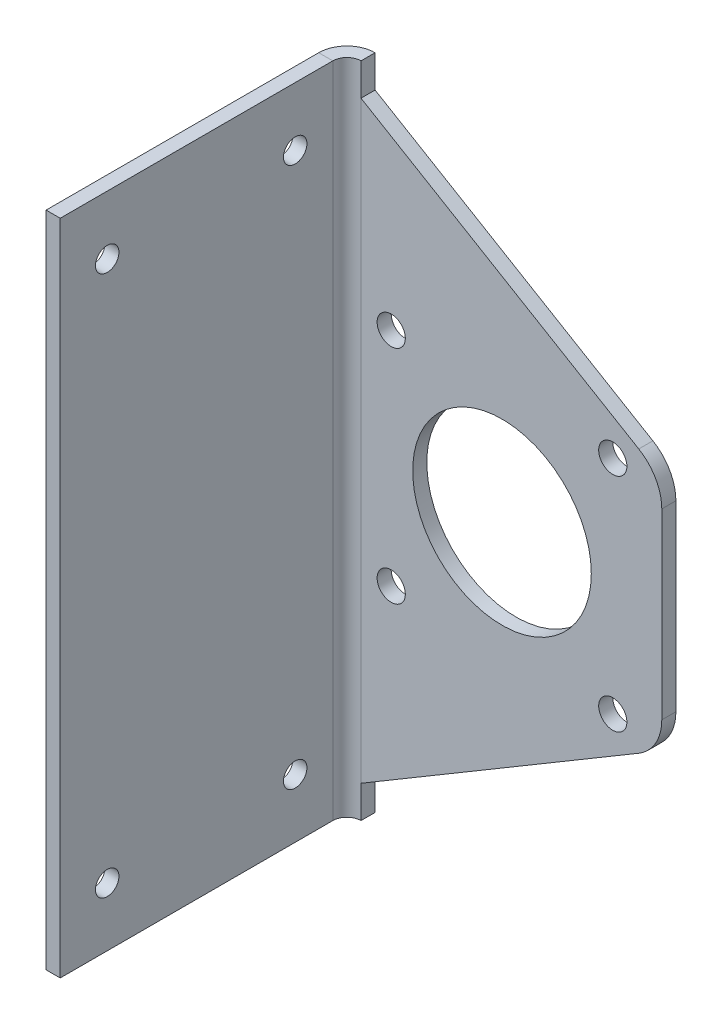
ISO-10303-21;
HEADER;
FILE_DESCRIPTION(('STEP AP214'),'2;1');
FILE_NAME('part.step','',(''),(''),'','','');
FILE_SCHEMA(('AUTOMOTIVE_DESIGN { 1 0 10303 214 1 1 1 1 }'));
ENDSEC;
DATA;
#1=APPLICATION_CONTEXT('core data for automotive mechanical design processes');
#2=APPLICATION_PROTOCOL_DEFINITION('international standard','automotive_design',2000,#1);
#3=PRODUCT_CONTEXT('',#1,'mechanical');
#4=PRODUCT('Part','Part','',(#3));
#5=PRODUCT_RELATED_PRODUCT_CATEGORY('part','',(#4));
#6=PRODUCT_DEFINITION_FORMATION('','',#4);
#7=PRODUCT_DEFINITION_CONTEXT('part definition',#1,'design');
#8=PRODUCT_DEFINITION('design','',#6,#7);
#9=PRODUCT_DEFINITION_SHAPE('','',#8);
#10=(LENGTH_UNIT() NAMED_UNIT(*) SI_UNIT(.MILLI.,.METRE.));
#11=(NAMED_UNIT(*) PLANE_ANGLE_UNIT() SI_UNIT($,.RADIAN.));
#12=(NAMED_UNIT(*) SI_UNIT($,.STERADIAN.) SOLID_ANGLE_UNIT());
#13=UNCERTAINTY_MEASURE_WITH_UNIT(LENGTH_MEASURE(1.E-05),#10,'distance_accuracy_value','');
#14=(GEOMETRIC_REPRESENTATION_CONTEXT(3) GLOBAL_UNCERTAINTY_ASSIGNED_CONTEXT((#13)) GLOBAL_UNIT_ASSIGNED_CONTEXT((#10,
#11,#12)) REPRESENTATION_CONTEXT('',''));
#15=CARTESIAN_POINT('',(0.,0.,0.));
#16=DIRECTION('',(0.,0.,1.));
#17=DIRECTION('',(1.,0.,0.));
#18=AXIS2_PLACEMENT_3D('',#15,#16,#17);
#19=CARTESIAN_POINT('',(-35.,140.,3.));
#20=DIRECTION('',(0.,0.,-1.));
#21=DIRECTION('',(-1.,0.,0.));
#22=AXIS2_PLACEMENT_3D('',#19,#20,#21);
#23=PLANE('',#22);
#24=CARTESIAN_POINT('',(-22.57,46.43,3.));
#25=DIRECTION('',(0.,0.,1.));
#26=DIRECTION('',(1.,0.,0.));
#27=AXIS2_PLACEMENT_3D('',#24,#25,#26);
#28=CIRCLE('',#27,3.);
#29=CARTESIAN_POINT('',(-19.57,46.43,3.));
#30=VERTEX_POINT('',#29);
#31=EDGE_CURVE('E258',#30,#30,#28,.T.);
#32=ORIENTED_EDGE('',*,*,#31,.F.);
#33=EDGE_LOOP('',(#32));
#34=FACE_BOUND('',#33,.T.);
#35=CARTESIAN_POINT('',(24.57,46.43,3.));
#36=DIRECTION('',(0.,0.,1.));
#37=DIRECTION('',(1.,0.,0.));
#38=AXIS2_PLACEMENT_3D('',#35,#36,#37);
#39=CIRCLE('',#38,3.);
#40=CARTESIAN_POINT('',(27.57,46.43,3.));
#41=VERTEX_POINT('',#40);
#42=EDGE_CURVE('E277',#41,#41,#39,.T.);
#43=ORIENTED_EDGE('',*,*,#42,.F.);
#44=EDGE_LOOP('',(#43));
#45=FACE_BOUND('',#44,.T.);
#46=CARTESIAN_POINT('',(-22.57,93.57,3.));
#47=DIRECTION('',(0.,0.,1.));
#48=DIRECTION('',(1.,0.,0.));
#49=AXIS2_PLACEMENT_3D('',#46,#47,#48);
#50=CIRCLE('',#49,3.);
#51=CARTESIAN_POINT('',(-19.57,93.57,3.));
#52=VERTEX_POINT('',#51);
#53=EDGE_CURVE('E271',#52,#52,#50,.T.);
#54=ORIENTED_EDGE('',*,*,#53,.F.);
#55=EDGE_LOOP('',(#54));
#56=FACE_BOUND('',#55,.T.);
#57=CARTESIAN_POINT('',(24.57,93.57,3.));
#58=DIRECTION('',(0.,0.,1.));
#59=DIRECTION('',(1.,0.,0.));
#60=AXIS2_PLACEMENT_3D('',#57,#58,#59);
#61=CIRCLE('',#60,3.);
#62=CARTESIAN_POINT('',(27.57,93.57,3.));
#63=VERTEX_POINT('',#62);
#64=EDGE_CURVE('E265',#63,#63,#61,.T.);
#65=ORIENTED_EDGE('',*,*,#64,.F.);
#66=EDGE_LOOP('',(#65));
#67=FACE_BOUND('',#66,.T.);
#68=CARTESIAN_POINT('',(0.999999999999984,70.,3.));
#69=DIRECTION('',(0.,0.,1.));
#70=DIRECTION('',(1.,0.,0.));
#71=AXIS2_PLACEMENT_3D('',#68,#69,#70);
#72=CIRCLE('',#71,19.);
#73=CARTESIAN_POINT('',(20.,70.,3.));
#74=VERTEX_POINT('',#73);
#75=EDGE_CURVE('E264',#74,#74,#72,.T.);
#76=ORIENTED_EDGE('',*,*,#75,.F.);
#77=EDGE_LOOP('',(#76));
#78=FACE_BOUND('',#77,.T.);
#79=DIRECTION('',(0.,-1.,0.));
#80=VECTOR('',#79,1.);
#81=CARTESIAN_POINT('',(35.,140.,3.));
#82=LINE('',#81,#80);
#83=CARTESIAN_POINT('',(35.,89.4369115321401,3.));
#84=VERTEX_POINT('',#83);
#85=CARTESIAN_POINT('',(35.,50.5630884678599,3.));
#86=VERTEX_POINT('',#85);
#87=EDGE_CURVE('E181',#84,#86,#82,.T.);
#88=ORIENTED_EDGE('',*,*,#87,.F.);
#89=CARTESIAN_POINT('',(25.,89.4369115321401,3.));
#90=DIRECTION('',(0.,0.,-1.));
#91=DIRECTION('',(-1.,0.,0.));
#92=AXIS2_PLACEMENT_3D('',#89,#90,#91);
#93=CIRCLE('',#92,10.);
#94=CARTESIAN_POINT('',(30.1042062990609,98.0361602235449,3.));
#95=VERTEX_POINT('',#94);
#96=EDGE_CURVE('E78',#84,#95,#93,.F.);
#97=ORIENTED_EDGE('',*,*,#96,.T.);
#98=DIRECTION('',(-0.85992486914048,0.510420629906088,0.));
#99=VECTOR('',#98,1.);
#100=CARTESIAN_POINT('',(-29.,133.118302038352,3.));
#101=LINE('',#100,#99);
#102=CARTESIAN_POINT('',(-29.,133.118302038352,3.));
#103=VERTEX_POINT('',#102);
#104=EDGE_CURVE('E229',#95,#103,#101,.T.);
#105=ORIENTED_EDGE('',*,*,#104,.T.);
#106=DIRECTION('',(0.,-1.,0.));
#107=VECTOR('',#106,1.);
#108=CARTESIAN_POINT('',(-29.,0.,3.));
#109=LINE('',#108,#107);
#110=CARTESIAN_POINT('',(-29.,6.88169796164767,3.));
#111=VERTEX_POINT('',#110);
#112=EDGE_CURVE('E154',#111,#103,#109,.F.);
#113=ORIENTED_EDGE('',*,*,#112,.F.);
#114=DIRECTION('',(0.85992486914048,0.510420629906088,0.));
#115=VECTOR('',#114,1.);
#116=CARTESIAN_POINT('',(-29.,6.88169796164767,3.));
#117=LINE('',#116,#115);
#118=CARTESIAN_POINT('',(30.1042062990609,41.9638397764551,3.));
#119=VERTEX_POINT('',#118);
#120=EDGE_CURVE('E206',#111,#119,#117,.T.);
#121=ORIENTED_EDGE('',*,*,#120,.T.);
#122=CARTESIAN_POINT('',(25.,50.5630884678599,3.));
#123=DIRECTION('',(0.,0.,-1.));
#124=DIRECTION('',(-1.,0.,0.));
#125=AXIS2_PLACEMENT_3D('',#122,#123,#124);
#126=CIRCLE('',#125,10.);
#127=EDGE_CURVE('E186',#119,#86,#126,.F.);
#128=ORIENTED_EDGE('',*,*,#127,.T.);
#129=EDGE_LOOP('',(#88,#97,#105,#113,#121,#128));
#130=FACE_BOUND('',#129,.T.);
#131=ADVANCED_FACE('F56',(#34,#45,#56,#67,#78,#130),#23,.F.);
#132=CARTESIAN_POINT('',(-35.,140.,0.));
#133=DIRECTION('',(0.,0.,-1.));
#134=DIRECTION('',(-1.,0.,0.));
#135=AXIS2_PLACEMENT_3D('',#132,#133,#134);
#136=PLANE('',#135);
#137=CARTESIAN_POINT('',(-22.57,46.43,0.));
#138=DIRECTION('',(0.,0.,1.));
#139=DIRECTION('',(1.,0.,0.));
#140=AXIS2_PLACEMENT_3D('',#137,#138,#139);
#141=CIRCLE('',#140,3.);
#142=CARTESIAN_POINT('',(-19.57,46.43,0.));
#143=VERTEX_POINT('',#142);
#144=EDGE_CURVE('E280',#143,#143,#141,.T.);
#145=ORIENTED_EDGE('',*,*,#144,.T.);
#146=EDGE_LOOP('',(#145));
#147=FACE_BOUND('',#146,.T.);
#148=CARTESIAN_POINT('',(24.57,46.43,0.));
#149=DIRECTION('',(0.,0.,1.));
#150=DIRECTION('',(1.,0.,0.));
#151=AXIS2_PLACEMENT_3D('',#148,#149,#150);
#152=CIRCLE('',#151,3.);
#153=CARTESIAN_POINT('',(27.57,46.43,0.));
#154=VERTEX_POINT('',#153);
#155=EDGE_CURVE('E274',#154,#154,#152,.T.);
#156=ORIENTED_EDGE('',*,*,#155,.T.);
#157=EDGE_LOOP('',(#156));
#158=FACE_BOUND('',#157,.T.);
#159=CARTESIAN_POINT('',(-22.57,93.57,0.));
#160=DIRECTION('',(0.,0.,1.));
#161=DIRECTION('',(1.,0.,0.));
#162=AXIS2_PLACEMENT_3D('',#159,#160,#161);
#163=CIRCLE('',#162,3.);
#164=CARTESIAN_POINT('',(-19.57,93.57,0.));
#165=VERTEX_POINT('',#164);
#166=EDGE_CURVE('E268',#165,#165,#163,.T.);
#167=ORIENTED_EDGE('',*,*,#166,.T.);
#168=EDGE_LOOP('',(#167));
#169=FACE_BOUND('',#168,.T.);
#170=CARTESIAN_POINT('',(24.57,93.57,0.));
#171=DIRECTION('',(0.,0.,1.));
#172=DIRECTION('',(1.,0.,0.));
#173=AXIS2_PLACEMENT_3D('',#170,#171,#172);
#174=CIRCLE('',#173,3.);
#175=CARTESIAN_POINT('',(27.57,93.57,0.));
#176=VERTEX_POINT('',#175);
#177=EDGE_CURVE('E261',#176,#176,#174,.T.);
#178=ORIENTED_EDGE('',*,*,#177,.T.);
#179=EDGE_LOOP('',(#178));
#180=FACE_BOUND('',#179,.T.);
#181=CARTESIAN_POINT('',(0.999999999999984,70.,0.));
#182=DIRECTION('',(0.,0.,1.));
#183=DIRECTION('',(1.,0.,0.));
#184=AXIS2_PLACEMENT_3D('',#181,#182,#183);
#185=CIRCLE('',#184,19.);
#186=CARTESIAN_POINT('',(20.,70.,0.));
#187=VERTEX_POINT('',#186);
#188=EDGE_CURVE('E285',#187,#187,#185,.T.);
#189=ORIENTED_EDGE('',*,*,#188,.T.);
#190=EDGE_LOOP('',(#189));
#191=FACE_BOUND('',#190,.T.);
#192=DIRECTION('',(-0.85992486914048,0.510420629906088,0.));
#193=VECTOR('',#192,1.);
#194=CARTESIAN_POINT('',(-29.,133.118302038352,0.));
#195=LINE('',#194,#193);
#196=CARTESIAN_POINT('',(30.1042062990609,98.0361602235449,0.));
#197=VERTEX_POINT('',#196);
#198=CARTESIAN_POINT('',(-29.,133.118302038352,0.));
#199=VERTEX_POINT('',#198);
#200=EDGE_CURVE('E234',#197,#199,#195,.T.);
#201=ORIENTED_EDGE('',*,*,#200,.F.);
#202=CARTESIAN_POINT('',(25.,89.4369115321401,0.));
#203=DIRECTION('',(0.,0.,-1.));
#204=DIRECTION('',(-1.,0.,0.));
#205=AXIS2_PLACEMENT_3D('',#202,#203,#204);
#206=CIRCLE('',#205,10.);
#207=CARTESIAN_POINT('',(35.,89.4369115321401,0.));
#208=VERTEX_POINT('',#207);
#209=EDGE_CURVE('E13',#197,#208,#206,.T.);
#210=ORIENTED_EDGE('',*,*,#209,.T.);
#211=DIRECTION('',(0.,-1.,0.));
#212=VECTOR('',#211,1.);
#213=CARTESIAN_POINT('',(35.,140.,0.));
#214=LINE('',#213,#212);
#215=CARTESIAN_POINT('',(35.,50.5630884678599,0.));
#216=VERTEX_POINT('',#215);
#217=EDGE_CURVE('E178',#208,#216,#214,.T.);
#218=ORIENTED_EDGE('',*,*,#217,.T.);
#219=CARTESIAN_POINT('',(25.,50.5630884678599,0.));
#220=DIRECTION('',(0.,0.,-1.));
#221=DIRECTION('',(-1.,0.,0.));
#222=AXIS2_PLACEMENT_3D('',#219,#220,#221);
#223=CIRCLE('',#222,10.);
#224=CARTESIAN_POINT('',(30.1042062990609,41.9638397764551,0.));
#225=VERTEX_POINT('',#224);
#226=EDGE_CURVE('E192',#216,#225,#223,.T.);
#227=ORIENTED_EDGE('',*,*,#226,.T.);
#228=DIRECTION('',(0.85992486914048,0.510420629906088,0.));
#229=VECTOR('',#228,1.);
#230=CARTESIAN_POINT('',(-29.,6.88169796164767,0.));
#231=LINE('',#230,#229);
#232=CARTESIAN_POINT('',(-29.,6.88169796164767,0.));
#233=VERTEX_POINT('',#232);
#234=EDGE_CURVE('E216',#233,#225,#231,.T.);
#235=ORIENTED_EDGE('',*,*,#234,.F.);
#236=DIRECTION('',(0.,-1.,0.));
#237=VECTOR('',#236,1.);
#238=CARTESIAN_POINT('',(-29.,0.,0.));
#239=LINE('',#238,#237);
#240=EDGE_CURVE('E318',#233,#199,#239,.F.);
#241=ORIENTED_EDGE('',*,*,#240,.T.);
#242=EDGE_LOOP('',(#201,#210,#218,#227,#235,#241));
#243=FACE_BOUND('',#242,.T.);
#244=ADVANCED_FACE('F214',(#147,#158,#169,#180,#191,#243),#136,.T.);
#245=CARTESIAN_POINT('',(35.,140.,0.));
#246=DIRECTION('',(1.,0.,0.));
#247=DIRECTION('',(0.,0.,-1.));
#248=AXIS2_PLACEMENT_3D('',#245,#246,#247);
#249=PLANE('',#248);
#250=ORIENTED_EDGE('',*,*,#217,.F.);
#251=DIRECTION('',(0.,0.,-1.));
#252=VECTOR('',#251,1.);
#253=CARTESIAN_POINT('',(35.,89.4369115321401,0.));
#254=LINE('',#253,#252);
#255=EDGE_CURVE('E194',#208,#84,#254,.F.);
#256=ORIENTED_EDGE('',*,*,#255,.T.);
#257=ORIENTED_EDGE('',*,*,#87,.T.);
#258=DIRECTION('',(0.,0.,-1.));
#259=VECTOR('',#258,1.);
#260=CARTESIAN_POINT('',(35.,50.5630884678599,0.));
#261=LINE('',#260,#259);
#262=EDGE_CURVE('E189',#86,#216,#261,.T.);
#263=ORIENTED_EDGE('',*,*,#262,.T.);
#264=EDGE_LOOP('',(#250,#256,#257,#263));
#265=FACE_BOUND('',#264,.T.);
#266=ADVANCED_FACE('F200',(#265),#249,.T.);
#267=CARTESIAN_POINT('',(-29.,140.,6.));
#268=DIRECTION('',(0.,1.,0.));
#269=DIRECTION('',(0.,0.,1.));
#270=AXIS2_PLACEMENT_3D('',#267,#268,#269);
#271=PLANE('',#270);
#272=DIRECTION('',(-1.,0.,0.));
#273=VECTOR('',#272,1.);
#274=CARTESIAN_POINT('',(-35.,140.,5.99999999999998));
#275=LINE('',#274,#273);
#276=CARTESIAN_POINT('',(-32.,140.,5.99999999999999));
#277=VERTEX_POINT('',#276);
#278=CARTESIAN_POINT('',(-35.,140.,5.99999999999998));
#279=VERTEX_POINT('',#278);
#280=EDGE_CURVE('E288',#277,#279,#275,.T.);
#281=ORIENTED_EDGE('',*,*,#280,.F.);
#282=CARTESIAN_POINT('',(-29.,140.,6.));
#283=DIRECTION('',(0.,-1.,0.));
#284=DIRECTION('',(0.,0.,-1.));
#285=AXIS2_PLACEMENT_3D('',#282,#283,#284);
#286=CIRCLE('',#285,3.);
#287=CARTESIAN_POINT('',(-29.,140.,3.));
#288=VERTEX_POINT('',#287);
#289=EDGE_CURVE('E153',#288,#277,#286,.F.);
#290=ORIENTED_EDGE('',*,*,#289,.F.);
#291=DIRECTION('',(0.,0.,-1.));
#292=VECTOR('',#291,1.);
#293=CARTESIAN_POINT('',(-29.,140.,3.));
#294=LINE('',#293,#292);
#295=CARTESIAN_POINT('',(-29.,140.,0.));
#296=VERTEX_POINT('',#295);
#297=EDGE_CURVE('E164',#288,#296,#294,.T.);
#298=ORIENTED_EDGE('',*,*,#297,.T.);
#299=CARTESIAN_POINT('',(-29.,140.,6.));
#300=DIRECTION('',(0.,-1.,0.));
#301=DIRECTION('',(0.,0.,-1.));
#302=AXIS2_PLACEMENT_3D('',#299,#300,#301);
#303=CIRCLE('',#302,6.);
#304=EDGE_CURVE('E165',#296,#279,#303,.F.);
#305=ORIENTED_EDGE('',*,*,#304,.T.);
#306=EDGE_LOOP('',(#281,#290,#298,#305));
#307=FACE_BOUND('',#306,.T.);
#308=ADVANCED_FACE('F346',(#307),#271,.T.);
#309=CARTESIAN_POINT('',(-29.,0.,6.));
#310=DIRECTION('',(0.,1.,0.));
#311=DIRECTION('',(0.,0.,1.));
#312=AXIS2_PLACEMENT_3D('',#309,#310,#311);
#313=PLANE('',#312);
#314=CARTESIAN_POINT('',(-29.,0.,6.));
#315=DIRECTION('',(0.,-1.,0.));
#316=DIRECTION('',(0.,0.,-1.));
#317=AXIS2_PLACEMENT_3D('',#314,#315,#316);
#318=CIRCLE('',#317,3.);
#319=CARTESIAN_POINT('',(-32.,0.,5.99999999999999));
#320=VERTEX_POINT('',#319);
#321=CARTESIAN_POINT('',(-29.,0.,3.));
#322=VERTEX_POINT('',#321);
#323=EDGE_CURVE('E161',#320,#322,#318,.T.);
#324=ORIENTED_EDGE('',*,*,#323,.F.);
#325=DIRECTION('',(-1.,0.,0.));
#326=VECTOR('',#325,1.);
#327=CARTESIAN_POINT('',(-32.,0.,5.99999999999999));
#328=LINE('',#327,#326);
#329=CARTESIAN_POINT('',(-35.,0.,5.99999999999998));
#330=VERTEX_POINT('',#329);
#331=EDGE_CURVE('E311',#320,#330,#328,.T.);
#332=ORIENTED_EDGE('',*,*,#331,.T.);
#333=CARTESIAN_POINT('',(-29.,0.,6.));
#334=DIRECTION('',(0.,-1.,0.));
#335=DIRECTION('',(0.,0.,-1.));
#336=AXIS2_PLACEMENT_3D('',#333,#334,#335);
#337=CIRCLE('',#336,6.);
#338=CARTESIAN_POINT('',(-29.,0.,0.));
#339=VERTEX_POINT('',#338);
#340=EDGE_CURVE('E163',#330,#339,#337,.T.);
#341=ORIENTED_EDGE('',*,*,#340,.T.);
#342=DIRECTION('',(0.,0.,-1.));
#343=VECTOR('',#342,1.);
#344=CARTESIAN_POINT('',(-29.,0.,3.));
#345=LINE('',#344,#343);
#346=EDGE_CURVE('E145',#322,#339,#345,.T.);
#347=ORIENTED_EDGE('',*,*,#346,.F.);
#348=EDGE_LOOP('',(#324,#332,#341,#347));
#349=FACE_BOUND('',#348,.T.);
#350=ADVANCED_FACE('F159',(#349),#313,.F.);
#351=CARTESIAN_POINT('',(-29.,0.,6.));
#352=DIRECTION('',(0.,-1.,0.));
#353=DIRECTION('',(-1.,0.,0.));
#354=AXIS2_PLACEMENT_3D('',#351,#352,#353);
#355=CYLINDRICAL_SURFACE('',#354,6.);
#356=EDGE_CURVE('E316',#339,#233,#239,.F.);
#357=ORIENTED_EDGE('',*,*,#356,.F.);
#358=ORIENTED_EDGE('',*,*,#340,.F.);
#359=DIRECTION('',(0.,-1.,0.));
#360=VECTOR('',#359,1.);
#361=CARTESIAN_POINT('',(-35.,0.,5.99999999999998));
#362=LINE('',#361,#360);
#363=EDGE_CURVE('E308',#279,#330,#362,.T.);
#364=ORIENTED_EDGE('',*,*,#363,.F.);
#365=ORIENTED_EDGE('',*,*,#304,.F.);
#366=DIRECTION('',(0.,1.,0.));
#367=VECTOR('',#366,1.);
#368=CARTESIAN_POINT('',(-29.,117.565096139335,0.));
#369=LINE('',#368,#367);
#370=EDGE_CURVE('E231',#199,#296,#369,.T.);
#371=ORIENTED_EDGE('',*,*,#370,.F.);
#372=ORIENTED_EDGE('',*,*,#240,.F.);
#373=EDGE_LOOP('',(#357,#358,#364,#365,#371,#372));
#374=FACE_BOUND('',#373,.T.);
#375=ADVANCED_FACE('F344',(#374),#355,.T.);
#376=CARTESIAN_POINT('',(-29.,0.,6.));
#377=DIRECTION('',(0.,-1.,0.));
#378=DIRECTION('',(-1.,0.,0.));
#379=AXIS2_PLACEMENT_3D('',#376,#377,#378);
#380=CYLINDRICAL_SURFACE('',#379,3.);
#381=EDGE_CURVE('E142',#322,#111,#109,.F.);
#382=ORIENTED_EDGE('',*,*,#381,.T.);
#383=ORIENTED_EDGE('',*,*,#112,.T.);
#384=DIRECTION('',(0.,1.,0.));
#385=VECTOR('',#384,1.);
#386=CARTESIAN_POINT('',(-29.,140.,3.));
#387=LINE('',#386,#385);
#388=EDGE_CURVE('E224',#103,#288,#387,.T.);
#389=ORIENTED_EDGE('',*,*,#388,.T.);
#390=ORIENTED_EDGE('',*,*,#289,.T.);
#391=DIRECTION('',(0.,1.,0.));
#392=VECTOR('',#391,1.);
#393=CARTESIAN_POINT('',(-32.,140.,5.99999999999999));
#394=LINE('',#393,#392);
#395=EDGE_CURVE('E170',#277,#320,#394,.F.);
#396=ORIENTED_EDGE('',*,*,#395,.T.);
#397=ORIENTED_EDGE('',*,*,#323,.T.);
#398=EDGE_LOOP('',(#382,#383,#389,#390,#396,#397));
#399=FACE_BOUND('',#398,.T.);
#400=ADVANCED_FACE('F167',(#399),#380,.F.);
#401=CARTESIAN_POINT('',(-35.,0.,2.99999999999999));
#402=DIRECTION('',(0.,-1.,0.));
#403=DIRECTION('',(0.,0.,-1.));
#404=AXIS2_PLACEMENT_3D('',#401,#402,#403);
#405=PLANE('',#404);
#406=DIRECTION('',(0.,0.,-1.));
#407=VECTOR('',#406,1.);
#408=CARTESIAN_POINT('',(-35.,0.,2.99999999999999));
#409=LINE('',#408,#407);
#410=CARTESIAN_POINT('',(-35.0000000000002,0.,64.));
#411=VERTEX_POINT('',#410);
#412=EDGE_CURVE('E293',#411,#330,#409,.T.);
#413=ORIENTED_EDGE('',*,*,#412,.T.);
#414=ORIENTED_EDGE('',*,*,#331,.F.);
#415=DIRECTION('',(0.,0.,1.));
#416=VECTOR('',#415,1.);
#417=CARTESIAN_POINT('',(-32.,0.,-1.23421309602284E-13));
#418=LINE('',#417,#416);
#419=CARTESIAN_POINT('',(-32.0000000000002,0.,64.));
#420=VERTEX_POINT('',#419);
#421=EDGE_CURVE('E301',#420,#320,#418,.F.);
#422=ORIENTED_EDGE('',*,*,#421,.F.);
#423=DIRECTION('',(1.,0.,0.));
#424=VECTOR('',#423,1.);
#425=CARTESIAN_POINT('',(-35.0000000000002,0.,64.));
#426=LINE('',#425,#424);
#427=EDGE_CURVE('E171',#411,#420,#426,.T.);
#428=ORIENTED_EDGE('',*,*,#427,.F.);
#429=EDGE_LOOP('',(#413,#414,#422,#428));
#430=FACE_BOUND('',#429,.T.);
#431=ADVANCED_FACE('F338',(#430),#405,.T.);
#432=CARTESIAN_POINT('',(-35.0000000000002,140.,64.));
#433=DIRECTION('',(0.,1.,0.));
#434=DIRECTION('',(0.,0.,1.));
#435=AXIS2_PLACEMENT_3D('',#432,#433,#434);
#436=PLANE('',#435);
#437=DIRECTION('',(0.,0.,-1.));
#438=VECTOR('',#437,1.);
#439=CARTESIAN_POINT('',(-32.,140.,0.));
#440=LINE('',#439,#438);
#441=CARTESIAN_POINT('',(-32.0000000000002,140.,64.));
#442=VERTEX_POINT('',#441);
#443=EDGE_CURVE('E306',#277,#442,#440,.F.);
#444=ORIENTED_EDGE('',*,*,#443,.F.);
#445=ORIENTED_EDGE('',*,*,#280,.T.);
#446=DIRECTION('',(0.,0.,1.));
#447=VECTOR('',#446,1.);
#448=CARTESIAN_POINT('',(-35.0000000000002,140.,64.));
#449=LINE('',#448,#447);
#450=CARTESIAN_POINT('',(-35.0000000000002,140.,64.));
#451=VERTEX_POINT('',#450);
#452=EDGE_CURVE('E299',#279,#451,#449,.T.);
#453=ORIENTED_EDGE('',*,*,#452,.T.);
#454=DIRECTION('',(1.,0.,0.));
#455=VECTOR('',#454,1.);
#456=CARTESIAN_POINT('',(-35.0000000000002,140.,64.));
#457=LINE('',#456,#455);
#458=EDGE_CURVE('E173',#451,#442,#457,.T.);
#459=ORIENTED_EDGE('',*,*,#458,.T.);
#460=EDGE_LOOP('',(#444,#445,#453,#459));
#461=FACE_BOUND('',#460,.T.);
#462=ADVANCED_FACE('F330',(#461),#436,.T.);
#463=CARTESIAN_POINT('',(-35.,0.,-1.33895753618814E-13));
#464=DIRECTION('',(-1.,0.,0.));
#465=DIRECTION('',(0.,0.,1.));
#466=AXIS2_PLACEMENT_3D('',#463,#464,#465);
#467=PLANE('',#466);
#468=CARTESIAN_POINT('',(-35.0000000000002,12.5,53.9999999999988));
#469=DIRECTION('',(1.,0.,0.));
#470=DIRECTION('',(0.,0.,-1.));
#471=AXIS2_PLACEMENT_3D('',#468,#469,#470);
#472=CIRCLE('',#471,2.5);
#473=CARTESIAN_POINT('',(-35.0000000000002,12.5,51.4999999999988));
#474=VERTEX_POINT('',#473);
#475=EDGE_CURVE('E250',#474,#474,#472,.T.);
#476=ORIENTED_EDGE('',*,*,#475,.T.);
#477=EDGE_LOOP('',(#476));
#478=FACE_BOUND('',#477,.T.);
#479=CARTESIAN_POINT('',(-35.,12.5,13.9999999999997));
#480=DIRECTION('',(1.,0.,0.));
#481=DIRECTION('',(0.,0.,-1.));
#482=AXIS2_PLACEMENT_3D('',#479,#480,#481);
#483=CIRCLE('',#482,2.5);
#484=CARTESIAN_POINT('',(-35.,12.5,11.4999999999997));
#485=VERTEX_POINT('',#484);
#486=EDGE_CURVE('E244',#485,#485,#483,.T.);
#487=ORIENTED_EDGE('',*,*,#486,.T.);
#488=EDGE_LOOP('',(#487));
#489=FACE_BOUND('',#488,.T.);
#490=CARTESIAN_POINT('',(-35.,127.5,14.0000000000009));
#491=DIRECTION('',(1.,0.,0.));
#492=DIRECTION('',(0.,0.,-1.));
#493=AXIS2_PLACEMENT_3D('',#490,#491,#492);
#494=CIRCLE('',#493,2.5);
#495=CARTESIAN_POINT('',(-35.,127.5,11.5000000000009));
#496=VERTEX_POINT('',#495);
#497=EDGE_CURVE('E237',#496,#496,#494,.T.);
#498=ORIENTED_EDGE('',*,*,#497,.T.);
#499=EDGE_LOOP('',(#498));
#500=FACE_BOUND('',#499,.T.);
#501=CARTESIAN_POINT('',(-35.0000000000002,127.5,54.));
#502=DIRECTION('',(1.,0.,0.));
#503=DIRECTION('',(0.,0.,-1.));
#504=AXIS2_PLACEMENT_3D('',#501,#502,#503);
#505=CIRCLE('',#504,2.5);
#506=CARTESIAN_POINT('',(-35.0000000000002,127.5,51.5));
#507=VERTEX_POINT('',#506);
#508=EDGE_CURVE('E255',#507,#507,#505,.T.);
#509=ORIENTED_EDGE('',*,*,#508,.T.);
#510=EDGE_LOOP('',(#509));
#511=FACE_BOUND('',#510,.T.);
#512=ORIENTED_EDGE('',*,*,#452,.F.);
#513=ORIENTED_EDGE('',*,*,#363,.T.);
#514=ORIENTED_EDGE('',*,*,#412,.F.);
#515=DIRECTION('',(0.,-1.,0.));
#516=VECTOR('',#515,1.);
#517=CARTESIAN_POINT('',(-35.0000000000002,0.,64.));
#518=LINE('',#517,#516);
#519=EDGE_CURVE('E296',#451,#411,#518,.T.);
#520=ORIENTED_EDGE('',*,*,#519,.F.);
#521=EDGE_LOOP('',(#512,#513,#514,#520));
#522=FACE_BOUND('',#521,.T.);
#523=ADVANCED_FACE('F341',(#478,#489,#500,#511,#522),#467,.T.);
#524=CARTESIAN_POINT('',(-32.,0.,-1.23421309602284E-13));
#525=DIRECTION('',(-1.,0.,0.));
#526=DIRECTION('',(0.,0.,1.));
#527=AXIS2_PLACEMENT_3D('',#524,#525,#526);
#528=PLANE('',#527);
#529=CARTESIAN_POINT('',(-32.0000000000002,12.5,53.9999999999988));
#530=DIRECTION('',(1.,0.,0.));
#531=DIRECTION('',(0.,0.,-1.));
#532=AXIS2_PLACEMENT_3D('',#529,#530,#531);
#533=CIRCLE('',#532,2.5);
#534=CARTESIAN_POINT('',(-32.0000000000002,12.5,51.4999999999988));
#535=VERTEX_POINT('',#534);
#536=EDGE_CURVE('E228',#535,#535,#533,.T.);
#537=ORIENTED_EDGE('',*,*,#536,.F.);
#538=EDGE_LOOP('',(#537));
#539=FACE_BOUND('',#538,.T.);
#540=CARTESIAN_POINT('',(-32.,12.5,13.9999999999997));
#541=DIRECTION('',(1.,0.,0.));
#542=DIRECTION('',(0.,0.,-1.));
#543=AXIS2_PLACEMENT_3D('',#540,#541,#542);
#544=CIRCLE('',#543,2.5);
#545=CARTESIAN_POINT('',(-32.,12.5,11.4999999999997));
#546=VERTEX_POINT('',#545);
#547=EDGE_CURVE('E247',#546,#546,#544,.T.);
#548=ORIENTED_EDGE('',*,*,#547,.F.);
#549=EDGE_LOOP('',(#548));
#550=FACE_BOUND('',#549,.T.);
#551=CARTESIAN_POINT('',(-32.,127.5,14.0000000000009));
#552=DIRECTION('',(1.,0.,0.));
#553=DIRECTION('',(0.,0.,-1.));
#554=AXIS2_PLACEMENT_3D('',#551,#552,#553);
#555=CIRCLE('',#554,2.5);
#556=CARTESIAN_POINT('',(-32.,127.5,11.5000000000009));
#557=VERTEX_POINT('',#556);
#558=EDGE_CURVE('E241',#557,#557,#555,.T.);
#559=ORIENTED_EDGE('',*,*,#558,.F.);
#560=EDGE_LOOP('',(#559));
#561=FACE_BOUND('',#560,.T.);
#562=CARTESIAN_POINT('',(-32.0000000000002,127.5,54.));
#563=DIRECTION('',(1.,0.,0.));
#564=DIRECTION('',(0.,0.,-1.));
#565=AXIS2_PLACEMENT_3D('',#562,#563,#564);
#566=CIRCLE('',#565,2.5);
#567=CARTESIAN_POINT('',(-32.0000000000002,127.5,51.5));
#568=VERTEX_POINT('',#567);
#569=EDGE_CURVE('E240',#568,#568,#566,.T.);
#570=ORIENTED_EDGE('',*,*,#569,.F.);
#571=EDGE_LOOP('',(#570));
#572=FACE_BOUND('',#571,.T.);
#573=ORIENTED_EDGE('',*,*,#395,.F.);
#574=ORIENTED_EDGE('',*,*,#443,.T.);
#575=DIRECTION('',(0.,1.,0.));
#576=VECTOR('',#575,1.);
#577=CARTESIAN_POINT('',(-32.0000000000002,0.,64.));
#578=LINE('',#577,#576);
#579=EDGE_CURVE('E303',#442,#420,#578,.F.);
#580=ORIENTED_EDGE('',*,*,#579,.T.);
#581=ORIENTED_EDGE('',*,*,#421,.T.);
#582=EDGE_LOOP('',(#573,#574,#580,#581));
#583=FACE_BOUND('',#582,.T.);
#584=ADVANCED_FACE('F326',(#539,#550,#561,#572,#583),#528,.F.);
#585=CARTESIAN_POINT('',(-35.0000000000002,0.,64.));
#586=DIRECTION('',(0.,0.,1.));
#587=DIRECTION('',(1.,0.,0.));
#588=AXIS2_PLACEMENT_3D('',#585,#586,#587);
#589=PLANE('',#588);
#590=ORIENTED_EDGE('',*,*,#579,.F.);
#591=ORIENTED_EDGE('',*,*,#458,.F.);
#592=ORIENTED_EDGE('',*,*,#519,.T.);
#593=ORIENTED_EDGE('',*,*,#427,.T.);
#594=EDGE_LOOP('',(#590,#591,#592,#593));
#595=FACE_BOUND('',#594,.T.);
#596=ADVANCED_FACE('F336',(#595),#589,.T.);
#597=CARTESIAN_POINT('',(0.999999999999984,70.,0.));
#598=DIRECTION('',(0.,0.,1.));
#599=DIRECTION('',(1.,0.,0.));
#600=AXIS2_PLACEMENT_3D('',#597,#598,#599);
#601=CYLINDRICAL_SURFACE('',#600,19.);
#602=ORIENTED_EDGE('',*,*,#188,.F.);
#603=EDGE_LOOP('',(#602));
#604=FACE_BOUND('',#603,.T.);
#605=ORIENTED_EDGE('',*,*,#75,.T.);
#606=EDGE_LOOP('',(#605));
#607=FACE_BOUND('',#606,.T.);
#608=ADVANCED_FACE('F380',(#604,#607),#601,.F.);
#609=CARTESIAN_POINT('',(24.57,93.57,0.));
#610=DIRECTION('',(0.,0.,1.));
#611=DIRECTION('',(1.,0.,0.));
#612=AXIS2_PLACEMENT_3D('',#609,#610,#611);
#613=CYLINDRICAL_SURFACE('',#612,3.);
#614=ORIENTED_EDGE('',*,*,#177,.F.);
#615=EDGE_LOOP('',(#614));
#616=FACE_BOUND('',#615,.T.);
#617=ORIENTED_EDGE('',*,*,#64,.T.);
#618=EDGE_LOOP('',(#617));
#619=FACE_BOUND('',#618,.T.);
#620=ADVANCED_FACE('F391',(#616,#619),#613,.F.);
#621=CARTESIAN_POINT('',(-22.57,93.57,0.));
#622=DIRECTION('',(0.,0.,1.));
#623=DIRECTION('',(1.,0.,0.));
#624=AXIS2_PLACEMENT_3D('',#621,#622,#623);
#625=CYLINDRICAL_SURFACE('',#624,3.);
#626=ORIENTED_EDGE('',*,*,#166,.F.);
#627=EDGE_LOOP('',(#626));
#628=FACE_BOUND('',#627,.T.);
#629=ORIENTED_EDGE('',*,*,#53,.T.);
#630=EDGE_LOOP('',(#629));
#631=FACE_BOUND('',#630,.T.);
#632=ADVANCED_FACE('F401',(#628,#631),#625,.F.);
#633=CARTESIAN_POINT('',(24.57,46.43,0.));
#634=DIRECTION('',(0.,0.,1.));
#635=DIRECTION('',(1.,0.,0.));
#636=AXIS2_PLACEMENT_3D('',#633,#634,#635);
#637=CYLINDRICAL_SURFACE('',#636,3.);
#638=ORIENTED_EDGE('',*,*,#155,.F.);
#639=EDGE_LOOP('',(#638));
#640=FACE_BOUND('',#639,.T.);
#641=ORIENTED_EDGE('',*,*,#42,.T.);
#642=EDGE_LOOP('',(#641));
#643=FACE_BOUND('',#642,.T.);
#644=ADVANCED_FACE('F397',(#640,#643),#637,.F.);
#645=CARTESIAN_POINT('',(-22.57,46.43,0.));
#646=DIRECTION('',(0.,0.,1.));
#647=DIRECTION('',(1.,0.,0.));
#648=AXIS2_PLACEMENT_3D('',#645,#646,#647);
#649=CYLINDRICAL_SURFACE('',#648,3.);
#650=ORIENTED_EDGE('',*,*,#144,.F.);
#651=EDGE_LOOP('',(#650));
#652=FACE_BOUND('',#651,.T.);
#653=ORIENTED_EDGE('',*,*,#31,.T.);
#654=EDGE_LOOP('',(#653));
#655=FACE_BOUND('',#654,.T.);
#656=ADVANCED_FACE('F393',(#652,#655),#649,.F.);
#657=CARTESIAN_POINT('',(-35.0000000000002,127.5,54.));
#658=DIRECTION('',(1.,0.,0.));
#659=DIRECTION('',(0.,0.,-1.));
#660=AXIS2_PLACEMENT_3D('',#657,#658,#659);
#661=CYLINDRICAL_SURFACE('',#660,2.5);
#662=ORIENTED_EDGE('',*,*,#508,.F.);
#663=EDGE_LOOP('',(#662));
#664=FACE_BOUND('',#663,.T.);
#665=ORIENTED_EDGE('',*,*,#569,.T.);
#666=EDGE_LOOP('',(#665));
#667=FACE_BOUND('',#666,.T.);
#668=ADVANCED_FACE('F396',(#664,#667),#661,.F.);
#669=CARTESIAN_POINT('',(-35.,127.5,14.0000000000009));
#670=DIRECTION('',(1.,0.,0.));
#671=DIRECTION('',(0.,0.,-1.));
#672=AXIS2_PLACEMENT_3D('',#669,#670,#671);
#673=CYLINDRICAL_SURFACE('',#672,2.5);
#674=ORIENTED_EDGE('',*,*,#497,.F.);
#675=EDGE_LOOP('',(#674));
#676=FACE_BOUND('',#675,.T.);
#677=ORIENTED_EDGE('',*,*,#558,.T.);
#678=EDGE_LOOP('',(#677));
#679=FACE_BOUND('',#678,.T.);
#680=ADVANCED_FACE('F411',(#676,#679),#673,.F.);
#681=CARTESIAN_POINT('',(-35.,12.5,13.9999999999997));
#682=DIRECTION('',(1.,0.,0.));
#683=DIRECTION('',(0.,0.,-1.));
#684=AXIS2_PLACEMENT_3D('',#681,#682,#683);
#685=CYLINDRICAL_SURFACE('',#684,2.5);
#686=ORIENTED_EDGE('',*,*,#486,.F.);
#687=EDGE_LOOP('',(#686));
#688=FACE_BOUND('',#687,.T.);
#689=ORIENTED_EDGE('',*,*,#547,.T.);
#690=EDGE_LOOP('',(#689));
#691=FACE_BOUND('',#690,.T.);
#692=ADVANCED_FACE('F417',(#688,#691),#685,.F.);
#693=CARTESIAN_POINT('',(-35.0000000000002,12.5,53.9999999999988));
#694=DIRECTION('',(1.,0.,0.));
#695=DIRECTION('',(0.,0.,-1.));
#696=AXIS2_PLACEMENT_3D('',#693,#694,#695);
#697=CYLINDRICAL_SURFACE('',#696,2.5);
#698=ORIENTED_EDGE('',*,*,#475,.F.);
#699=EDGE_LOOP('',(#698));
#700=FACE_BOUND('',#699,.T.);
#701=ORIENTED_EDGE('',*,*,#536,.T.);
#702=EDGE_LOOP('',(#701));
#703=FACE_BOUND('',#702,.T.);
#704=ADVANCED_FACE('F413',(#700,#703),#697,.F.);
#705=CARTESIAN_POINT('',(-29.,133.118302038352,3.));
#706=DIRECTION('',(-0.510420629906088,-0.85992486914048,0.));
#707=DIRECTION('',(-0.85992486914048,0.510420629906088,0.));
#708=AXIS2_PLACEMENT_3D('',#705,#706,#707);
#709=PLANE('',#708);
#710=ORIENTED_EDGE('',*,*,#104,.F.);
#711=DIRECTION('',(0.,0.,1.));
#712=VECTOR('',#711,1.);
#713=CARTESIAN_POINT('',(30.1042062990609,98.0361602235449,3.));
#714=LINE('',#713,#712);
#715=EDGE_CURVE('E64',#95,#197,#714,.F.);
#716=ORIENTED_EDGE('',*,*,#715,.T.);
#717=ORIENTED_EDGE('',*,*,#200,.T.);
#718=DIRECTION('',(0.,0.,-1.));
#719=VECTOR('',#718,1.);
#720=CARTESIAN_POINT('',(-29.,133.118302038352,3.));
#721=LINE('',#720,#719);
#722=EDGE_CURVE('E220',#199,#103,#721,.F.);
#723=ORIENTED_EDGE('',*,*,#722,.T.);
#724=EDGE_LOOP('',(#710,#716,#717,#723));
#725=FACE_BOUND('',#724,.T.);
#726=ADVANCED_FACE('F416',(#725),#709,.F.);
#727=CARTESIAN_POINT('',(-29.,140.,3.));
#728=DIRECTION('',(-1.,0.,0.));
#729=DIRECTION('',(0.,1.,0.));
#730=AXIS2_PLACEMENT_3D('',#727,#728,#729);
#731=PLANE('',#730);
#732=ORIENTED_EDGE('',*,*,#370,.T.);
#733=ORIENTED_EDGE('',*,*,#297,.F.);
#734=ORIENTED_EDGE('',*,*,#388,.F.);
#735=ORIENTED_EDGE('',*,*,#722,.F.);
#736=EDGE_LOOP('',(#732,#733,#734,#735));
#737=FACE_BOUND('',#736,.T.);
#738=ADVANCED_FACE('F348',(#737),#731,.F.);
#739=CARTESIAN_POINT('',(-29.,0.,3.));
#740=DIRECTION('',(-1.,0.,0.));
#741=DIRECTION('',(0.,1.,0.));
#742=AXIS2_PLACEMENT_3D('',#739,#740,#741);
#743=PLANE('',#742);
#744=ORIENTED_EDGE('',*,*,#346,.T.);
#745=ORIENTED_EDGE('',*,*,#356,.T.);
#746=DIRECTION('',(0.,0.,-1.));
#747=VECTOR('',#746,1.);
#748=CARTESIAN_POINT('',(-29.,6.88169796164767,3.));
#749=LINE('',#748,#747);
#750=EDGE_CURVE('E148',#233,#111,#749,.F.);
#751=ORIENTED_EDGE('',*,*,#750,.T.);
#752=ORIENTED_EDGE('',*,*,#381,.F.);
#753=EDGE_LOOP('',(#744,#745,#751,#752));
#754=FACE_BOUND('',#753,.T.);
#755=ADVANCED_FACE('F144',(#754),#743,.F.);
#756=CARTESIAN_POINT('',(-29.,6.88169796164767,3.));
#757=DIRECTION('',(-0.510420629906088,0.85992486914048,0.));
#758=DIRECTION('',(0.85992486914048,0.510420629906088,0.));
#759=AXIS2_PLACEMENT_3D('',#756,#757,#758);
#760=PLANE('',#759);
#761=ORIENTED_EDGE('',*,*,#234,.T.);
#762=DIRECTION('',(0.,0.,1.));
#763=VECTOR('',#762,1.);
#764=CARTESIAN_POINT('',(30.1042062990609,41.9638397764551,3.));
#765=LINE('',#764,#763);
#766=EDGE_CURVE('E183',#225,#119,#765,.T.);
#767=ORIENTED_EDGE('',*,*,#766,.T.);
#768=ORIENTED_EDGE('',*,*,#120,.F.);
#769=ORIENTED_EDGE('',*,*,#750,.F.);
#770=EDGE_LOOP('',(#761,#767,#768,#769));
#771=FACE_BOUND('',#770,.T.);
#772=ADVANCED_FACE('F219',(#771),#760,.F.);
#773=CARTESIAN_POINT('',(25.,50.5630884678599,3.));
#774=DIRECTION('',(0.,0.,-1.));
#775=DIRECTION('',(-1.,0.,0.));
#776=AXIS2_PLACEMENT_3D('',#773,#774,#775);
#777=CYLINDRICAL_SURFACE('',#776,10.);
#778=ORIENTED_EDGE('',*,*,#226,.F.);
#779=ORIENTED_EDGE('',*,*,#262,.F.);
#780=ORIENTED_EDGE('',*,*,#127,.F.);
#781=ORIENTED_EDGE('',*,*,#766,.F.);
#782=EDGE_LOOP('',(#778,#779,#780,#781));
#783=FACE_BOUND('',#782,.T.);
#784=ADVANCED_FACE('F210',(#783),#777,.T.);
#785=CARTESIAN_POINT('',(25.,89.4369115321401,0.));
#786=DIRECTION('',(0.,0.,-1.));
#787=DIRECTION('',(-1.,0.,0.));
#788=AXIS2_PLACEMENT_3D('',#785,#786,#787);
#789=CYLINDRICAL_SURFACE('',#788,10.);
#790=ORIENTED_EDGE('',*,*,#209,.F.);
#791=ORIENTED_EDGE('',*,*,#715,.F.);
#792=ORIENTED_EDGE('',*,*,#96,.F.);
#793=ORIENTED_EDGE('',*,*,#255,.F.);
#794=EDGE_LOOP('',(#790,#791,#792,#793));
#795=FACE_BOUND('',#794,.T.);
#796=ADVANCED_FACE('F58',(#795),#789,.T.);
#797=CLOSED_SHELL('',(#131,#244,#266,#308,#350,#375,#400,#431,#462,#523,#584,#596,#608,#620,
#632,#644,#656,#668,#680,#692,#704,#726,#738,#755,#772,#784,#796));
#798=MANIFOLD_SOLID_BREP('B2',#797);
#799=ADVANCED_BREP_SHAPE_REPRESENTATION('',(#18,#798),#14);
#800=SHAPE_DEFINITION_REPRESENTATION(#9,#799);
ENDSEC;
END-ISO-10303-21;
